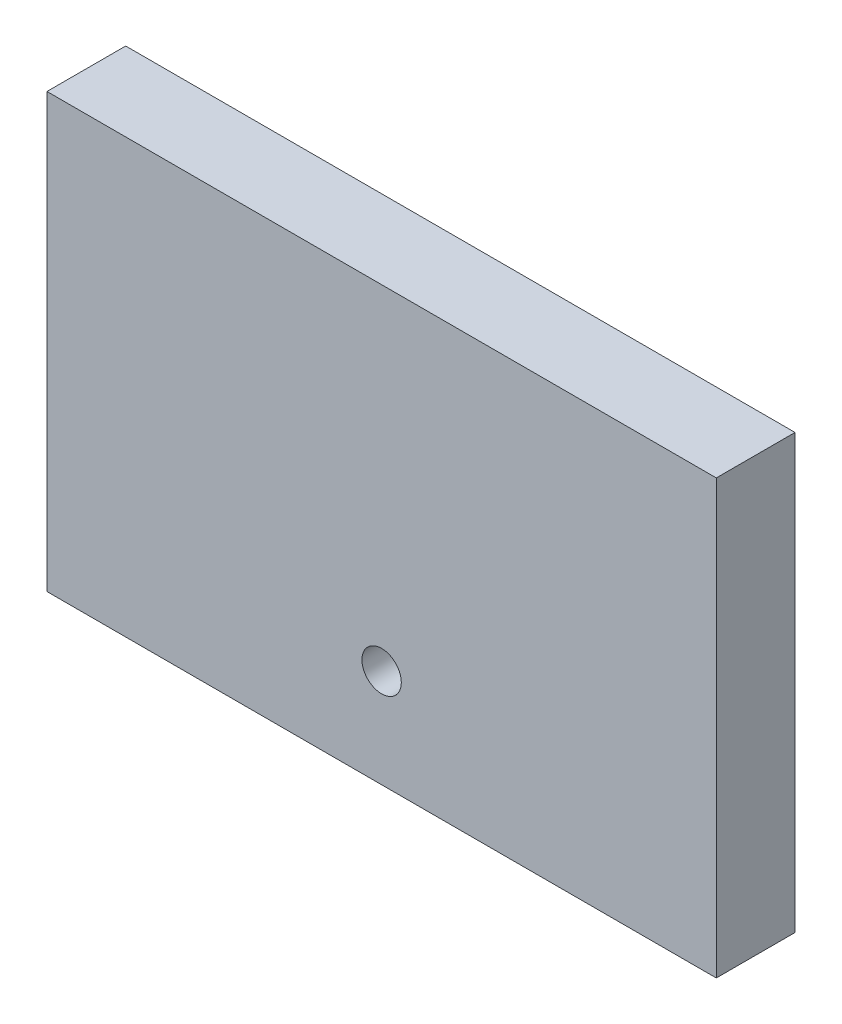
ISO-10303-21;
HEADER;
FILE_DESCRIPTION(('STEP AP214'),'2;1');
FILE_NAME('part.step','',(''),(''),'','','');
FILE_SCHEMA(('AUTOMOTIVE_DESIGN { 1 0 10303 214 1 1 1 1 }'));
ENDSEC;
DATA;
#1=APPLICATION_CONTEXT('core data for automotive mechanical design processes');
#2=APPLICATION_PROTOCOL_DEFINITION('international standard','automotive_design',2000,#1);
#3=PRODUCT_CONTEXT('',#1,'mechanical');
#4=PRODUCT('Part','Part','',(#3));
#5=PRODUCT_RELATED_PRODUCT_CATEGORY('part','',(#4));
#6=PRODUCT_DEFINITION_FORMATION('','',#4);
#7=PRODUCT_DEFINITION_CONTEXT('part definition',#1,'design');
#8=PRODUCT_DEFINITION('design','',#6,#7);
#9=PRODUCT_DEFINITION_SHAPE('','',#8);
#10=(LENGTH_UNIT() NAMED_UNIT(*) SI_UNIT(.MILLI.,.METRE.));
#11=(NAMED_UNIT(*) PLANE_ANGLE_UNIT() SI_UNIT($,.RADIAN.));
#12=(NAMED_UNIT(*) SI_UNIT($,.STERADIAN.) SOLID_ANGLE_UNIT());
#13=UNCERTAINTY_MEASURE_WITH_UNIT(LENGTH_MEASURE(1.E-05),#10,'distance_accuracy_value','');
#14=(GEOMETRIC_REPRESENTATION_CONTEXT(3) GLOBAL_UNCERTAINTY_ASSIGNED_CONTEXT((#13)) GLOBAL_UNIT_ASSIGNED_CONTEXT((#10,
#11,#12)) REPRESENTATION_CONTEXT('',''));
#15=CARTESIAN_POINT('',(0.,0.,0.));
#16=DIRECTION('',(0.,0.,1.));
#17=DIRECTION('',(1.,0.,0.));
#18=AXIS2_PLACEMENT_3D('',#15,#16,#17);
#19=CARTESIAN_POINT('',(0.,0.,2.));
#20=DIRECTION('',(1.,0.,0.));
#21=DIRECTION('',(0.,1.,0.));
#22=AXIS2_PLACEMENT_3D('',#19,#20,#21);
#23=PLANE('',#22);
#24=DIRECTION('',(0.,-1.,0.));
#25=VECTOR('',#24,1.);
#26=CARTESIAN_POINT('',(0.,0.,0.));
#27=LINE('',#26,#25);
#28=CARTESIAN_POINT('',(0.,0.,0.));
#29=VERTEX_POINT('',#28);
#30=CARTESIAN_POINT('',(0.,-11.,0.));
#31=VERTEX_POINT('',#30);
#32=EDGE_CURVE('E100',#29,#31,#27,.T.);
#33=ORIENTED_EDGE('',*,*,#32,.T.);
#34=DIRECTION('',(0.,0.,-1.));
#35=VECTOR('',#34,1.);
#36=CARTESIAN_POINT('',(0.,-11.,2.));
#37=LINE('',#36,#35);
#38=CARTESIAN_POINT('',(0.,-11.,2.));
#39=VERTEX_POINT('',#38);
#40=EDGE_CURVE('E11',#39,#31,#37,.T.);
#41=ORIENTED_EDGE('',*,*,#40,.F.);
#42=DIRECTION('',(0.,-1.,0.));
#43=VECTOR('',#42,1.);
#44=CARTESIAN_POINT('',(0.,0.,2.));
#45=LINE('',#44,#43);
#46=CARTESIAN_POINT('',(0.,0.,2.));
#47=VERTEX_POINT('',#46);
#48=EDGE_CURVE('E88',#47,#39,#45,.T.);
#49=ORIENTED_EDGE('',*,*,#48,.F.);
#50=DIRECTION('',(0.,0.,-1.));
#51=VECTOR('',#50,1.);
#52=CARTESIAN_POINT('',(0.,0.,2.));
#53=LINE('',#52,#51);
#54=EDGE_CURVE('E96',#47,#29,#53,.T.);
#55=ORIENTED_EDGE('',*,*,#54,.T.);
#56=EDGE_LOOP('',(#33,#41,#49,#55));
#57=FACE_BOUND('',#56,.T.);
#58=ADVANCED_FACE('F37',(#57),#23,.F.);
#59=CARTESIAN_POINT('',(0.,-11.,2.));
#60=DIRECTION('',(0.,1.,0.));
#61=DIRECTION('',(0.,0.,1.));
#62=AXIS2_PLACEMENT_3D('',#59,#60,#61);
#63=PLANE('',#62);
#64=DIRECTION('',(1.,0.,0.));
#65=VECTOR('',#64,1.);
#66=CARTESIAN_POINT('',(0.,-11.,0.));
#67=LINE('',#66,#65);
#68=CARTESIAN_POINT('',(17.,-11.,0.));
#69=VERTEX_POINT('',#68);
#70=EDGE_CURVE('E92',#31,#69,#67,.T.);
#71=ORIENTED_EDGE('',*,*,#70,.T.);
#72=DIRECTION('',(0.,0.,-1.));
#73=VECTOR('',#72,1.);
#74=CARTESIAN_POINT('',(17.,-11.,2.));
#75=LINE('',#74,#73);
#76=CARTESIAN_POINT('',(17.,-11.,2.));
#77=VERTEX_POINT('',#76);
#78=EDGE_CURVE('E45',#77,#69,#75,.T.);
#79=ORIENTED_EDGE('',*,*,#78,.F.);
#80=DIRECTION('',(1.,0.,0.));
#81=VECTOR('',#80,1.);
#82=CARTESIAN_POINT('',(0.,-11.,2.));
#83=LINE('',#82,#81);
#84=EDGE_CURVE('E83',#39,#77,#83,.T.);
#85=ORIENTED_EDGE('',*,*,#84,.F.);
#86=ORIENTED_EDGE('',*,*,#40,.T.);
#87=EDGE_LOOP('',(#71,#79,#85,#86));
#88=FACE_BOUND('',#87,.T.);
#89=ADVANCED_FACE('F91',(#88),#63,.F.);
#90=CARTESIAN_POINT('',(17.,0.,2.));
#91=DIRECTION('',(-1.,0.,0.));
#92=DIRECTION('',(0.,0.,1.));
#93=AXIS2_PLACEMENT_3D('',#90,#91,#92);
#94=PLANE('',#93);
#95=DIRECTION('',(0.,1.,0.));
#96=VECTOR('',#95,1.);
#97=CARTESIAN_POINT('',(17.,0.,0.));
#98=LINE('',#97,#96);
#99=CARTESIAN_POINT('',(17.,0.,0.));
#100=VERTEX_POINT('',#99);
#101=EDGE_CURVE('E70',#69,#100,#98,.T.);
#102=ORIENTED_EDGE('',*,*,#101,.T.);
#103=DIRECTION('',(0.,0.,-1.));
#104=VECTOR('',#103,1.);
#105=CARTESIAN_POINT('',(17.,0.,2.));
#106=LINE('',#105,#104);
#107=CARTESIAN_POINT('',(17.,0.,2.));
#108=VERTEX_POINT('',#107);
#109=EDGE_CURVE('E93',#108,#100,#106,.T.);
#110=ORIENTED_EDGE('',*,*,#109,.F.);
#111=DIRECTION('',(0.,1.,0.));
#112=VECTOR('',#111,1.);
#113=CARTESIAN_POINT('',(17.,0.,2.));
#114=LINE('',#113,#112);
#115=EDGE_CURVE('E86',#77,#108,#114,.T.);
#116=ORIENTED_EDGE('',*,*,#115,.F.);
#117=ORIENTED_EDGE('',*,*,#78,.T.);
#118=EDGE_LOOP('',(#102,#110,#116,#117));
#119=FACE_BOUND('',#118,.T.);
#120=ADVANCED_FACE('F94',(#119),#94,.F.);
#121=CARTESIAN_POINT('',(0.,0.,2.));
#122=DIRECTION('',(0.,-1.,0.));
#123=DIRECTION('',(0.,0.,-1.));
#124=AXIS2_PLACEMENT_3D('',#121,#122,#123);
#125=PLANE('',#124);
#126=DIRECTION('',(-1.,0.,0.));
#127=VECTOR('',#126,1.);
#128=CARTESIAN_POINT('',(0.,0.,0.));
#129=LINE('',#128,#127);
#130=EDGE_CURVE('E76',#100,#29,#129,.T.);
#131=ORIENTED_EDGE('',*,*,#130,.T.);
#132=ORIENTED_EDGE('',*,*,#54,.F.);
#133=DIRECTION('',(-1.,0.,0.));
#134=VECTOR('',#133,1.);
#135=CARTESIAN_POINT('',(0.,0.,2.));
#136=LINE('',#135,#134);
#137=EDGE_CURVE('E53',#108,#47,#136,.T.);
#138=ORIENTED_EDGE('',*,*,#137,.F.);
#139=ORIENTED_EDGE('',*,*,#109,.T.);
#140=EDGE_LOOP('',(#131,#132,#138,#139));
#141=FACE_BOUND('',#140,.T.);
#142=ADVANCED_FACE('F108',(#141),#125,.F.);
#143=CARTESIAN_POINT('',(0.,0.,2.));
#144=DIRECTION('',(0.,0.,1.));
#145=DIRECTION('',(1.,0.,0.));
#146=AXIS2_PLACEMENT_3D('',#143,#144,#145);
#147=PLANE('',#146);
#148=CARTESIAN_POINT('',(8.5,-8.5,2.));
#149=DIRECTION('',(0.,0.,1.));
#150=DIRECTION('',(1.,0.,0.));
#151=AXIS2_PLACEMENT_3D('',#148,#149,#150);
#152=CIRCLE('',#151,0.500000000000001);
#153=CARTESIAN_POINT('',(9.,-8.5,2.));
#154=VERTEX_POINT('',#153);
#155=EDGE_CURVE('E114',#154,#154,#152,.T.);
#156=ORIENTED_EDGE('',*,*,#155,.F.);
#157=EDGE_LOOP('',(#156));
#158=FACE_BOUND('',#157,.T.);
#159=ORIENTED_EDGE('',*,*,#48,.T.);
#160=ORIENTED_EDGE('',*,*,#84,.T.);
#161=ORIENTED_EDGE('',*,*,#115,.T.);
#162=ORIENTED_EDGE('',*,*,#137,.T.);
#163=EDGE_LOOP('',(#159,#160,#161,#162));
#164=FACE_BOUND('',#163,.T.);
#165=ADVANCED_FACE('F84',(#158,#164),#147,.T.);
#166=CARTESIAN_POINT('',(0.,0.,0.));
#167=DIRECTION('',(0.,0.,1.));
#168=DIRECTION('',(1.,0.,0.));
#169=AXIS2_PLACEMENT_3D('',#166,#167,#168);
#170=PLANE('',#169);
#171=CARTESIAN_POINT('',(8.5,-8.5,0.));
#172=DIRECTION('',(0.,0.,1.));
#173=DIRECTION('',(1.,0.,0.));
#174=AXIS2_PLACEMENT_3D('',#171,#172,#173);
#175=CIRCLE('',#174,0.500000000000001);
#176=CARTESIAN_POINT('',(9.,-8.5,0.));
#177=VERTEX_POINT('',#176);
#178=EDGE_CURVE('E103',#177,#177,#175,.T.);
#179=ORIENTED_EDGE('',*,*,#178,.T.);
#180=EDGE_LOOP('',(#179));
#181=FACE_BOUND('',#180,.T.);
#182=ORIENTED_EDGE('',*,*,#32,.F.);
#183=ORIENTED_EDGE('',*,*,#130,.F.);
#184=ORIENTED_EDGE('',*,*,#101,.F.);
#185=ORIENTED_EDGE('',*,*,#70,.F.);
#186=EDGE_LOOP('',(#182,#183,#184,#185));
#187=FACE_BOUND('',#186,.T.);
#188=ADVANCED_FACE('F111',(#181,#187),#170,.F.);
#189=CARTESIAN_POINT('',(8.5,-8.5,0.));
#190=DIRECTION('',(0.,0.,1.));
#191=DIRECTION('',(1.,0.,0.));
#192=AXIS2_PLACEMENT_3D('',#189,#190,#191);
#193=CYLINDRICAL_SURFACE('',#192,0.500000000000001);
#194=ORIENTED_EDGE('',*,*,#178,.F.);
#195=EDGE_LOOP('',(#194));
#196=FACE_BOUND('',#195,.T.);
#197=ORIENTED_EDGE('',*,*,#155,.T.);
#198=EDGE_LOOP('',(#197));
#199=FACE_BOUND('',#198,.T.);
#200=ADVANCED_FACE('F121',(#196,#199),#193,.F.);
#201=CLOSED_SHELL('',(#58,#89,#120,#142,#165,#188,#200));
#202=MANIFOLD_SOLID_BREP('B2',#201);
#203=ADVANCED_BREP_SHAPE_REPRESENTATION('',(#18,#202),#14);
#204=SHAPE_DEFINITION_REPRESENTATION(#9,#203);
ENDSEC;
END-ISO-10303-21;
